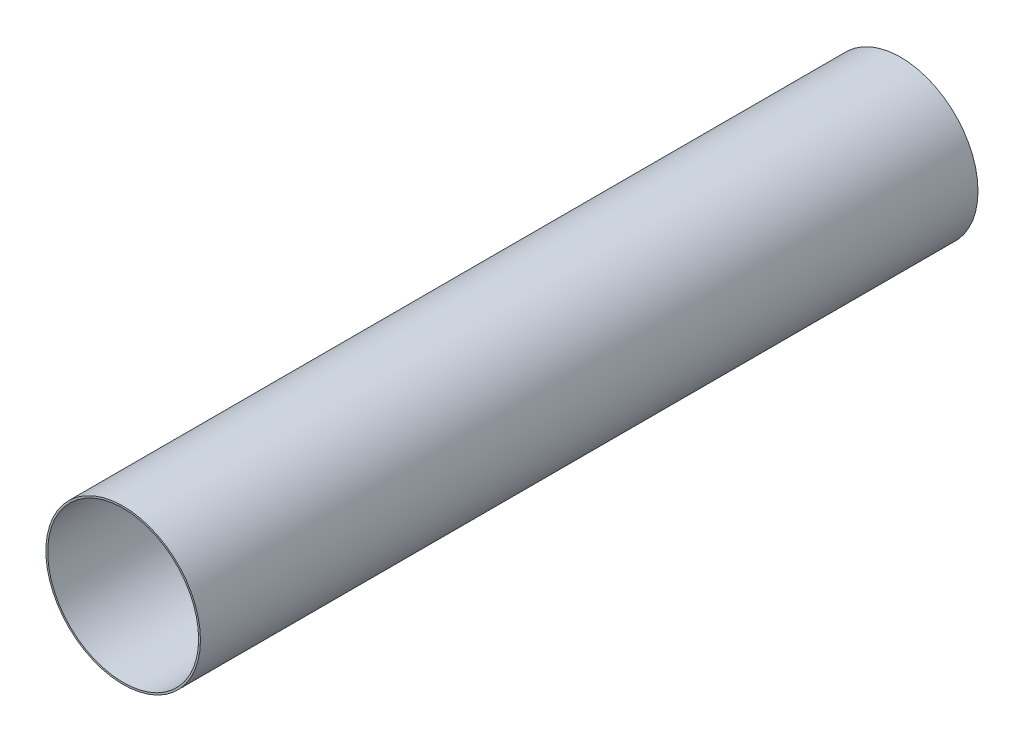
ISO-10303-21;
HEADER;
FILE_DESCRIPTION(('STEP AP214'),'2;1');
FILE_NAME('part.step','',(''),(''),'','','');
FILE_SCHEMA(('AUTOMOTIVE_DESIGN { 1 0 10303 214 1 1 1 1 }'));
ENDSEC;
DATA;
#1=APPLICATION_CONTEXT('core data for automotive mechanical design processes');
#2=APPLICATION_PROTOCOL_DEFINITION('international standard','automotive_design',2000,#1);
#3=PRODUCT_CONTEXT('',#1,'mechanical');
#4=PRODUCT('Part','Part','',(#3));
#5=PRODUCT_RELATED_PRODUCT_CATEGORY('part','',(#4));
#6=PRODUCT_DEFINITION_FORMATION('','',#4);
#7=PRODUCT_DEFINITION_CONTEXT('part definition',#1,'design');
#8=PRODUCT_DEFINITION('design','',#6,#7);
#9=PRODUCT_DEFINITION_SHAPE('','',#8);
#10=(LENGTH_UNIT() NAMED_UNIT(*) SI_UNIT(.MILLI.,.METRE.));
#11=(NAMED_UNIT(*) PLANE_ANGLE_UNIT() SI_UNIT($,.RADIAN.));
#12=(NAMED_UNIT(*) SI_UNIT($,.STERADIAN.) SOLID_ANGLE_UNIT());
#13=UNCERTAINTY_MEASURE_WITH_UNIT(LENGTH_MEASURE(1.E-05),#10,'distance_accuracy_value','');
#14=(GEOMETRIC_REPRESENTATION_CONTEXT(3) GLOBAL_UNCERTAINTY_ASSIGNED_CONTEXT((#13)) GLOBAL_UNIT_ASSIGNED_CONTEXT((#10,
#11,#12)) REPRESENTATION_CONTEXT('',''));
#15=CARTESIAN_POINT('',(0.,0.,0.));
#16=DIRECTION('',(0.,0.,1.));
#17=DIRECTION('',(1.,0.,0.));
#18=AXIS2_PLACEMENT_3D('',#15,#16,#17);
#19=CARTESIAN_POINT('',(0.,0.,850.));
#20=DIRECTION('',(0.,0.,1.));
#21=DIRECTION('',(1.,0.,0.));
#22=AXIS2_PLACEMENT_3D('',#19,#20,#21);
#23=CYLINDRICAL_SURFACE('',#22,82.5);
#24=CARTESIAN_POINT('',(0.,0.,0.));
#25=DIRECTION('',(0.,0.,1.));
#26=DIRECTION('',(1.,0.,0.));
#27=AXIS2_PLACEMENT_3D('',#24,#25,#26);
#28=CIRCLE('',#27,82.5);
#29=CARTESIAN_POINT('',(82.5,0.,0.));
#30=VERTEX_POINT('',#29);
#31=EDGE_CURVE('E27',#30,#30,#28,.F.);
#32=ORIENTED_EDGE('',*,*,#31,.T.);
#33=EDGE_LOOP('',(#32));
#34=FACE_BOUND('',#33,.T.);
#35=CARTESIAN_POINT('',(0.,0.,850.));
#36=DIRECTION('',(0.,0.,1.));
#37=DIRECTION('',(1.,0.,0.));
#38=AXIS2_PLACEMENT_3D('',#35,#36,#37);
#39=CIRCLE('',#38,82.5);
#40=CARTESIAN_POINT('',(82.5,0.,850.));
#41=VERTEX_POINT('',#40);
#42=EDGE_CURVE('E18',#41,#41,#39,.F.);
#43=ORIENTED_EDGE('',*,*,#42,.F.);
#44=EDGE_LOOP('',(#43));
#45=FACE_BOUND('',#44,.T.);
#46=ADVANCED_FACE('F15',(#34,#45),#23,.F.);
#47=CARTESIAN_POINT('',(0.,0.,850.));
#48=DIRECTION('',(0.,0.,1.));
#49=DIRECTION('',(1.,0.,0.));
#50=AXIS2_PLACEMENT_3D('',#47,#48,#49);
#51=PLANE('',#50);
#52=CARTESIAN_POINT('',(0.,0.,850.));
#53=DIRECTION('',(0.,0.,1.));
#54=DIRECTION('',(1.,0.,0.));
#55=AXIS2_PLACEMENT_3D('',#52,#53,#54);
#56=CIRCLE('',#55,84.5);
#57=CARTESIAN_POINT('',(84.5,0.,850.));
#58=VERTEX_POINT('',#57);
#59=EDGE_CURVE('E22',#58,#58,#56,.F.);
#60=ORIENTED_EDGE('',*,*,#59,.F.);
#61=EDGE_LOOP('',(#60));
#62=FACE_BOUND('',#61,.T.);
#63=ORIENTED_EDGE('',*,*,#42,.T.);
#64=EDGE_LOOP('',(#63));
#65=FACE_BOUND('',#64,.T.);
#66=ADVANCED_FACE('F35',(#62,#65),#51,.T.);
#67=CARTESIAN_POINT('',(0.,0.,0.));
#68=DIRECTION('',(0.,0.,1.));
#69=DIRECTION('',(1.,0.,0.));
#70=AXIS2_PLACEMENT_3D('',#67,#68,#69);
#71=PLANE('',#70);
#72=CARTESIAN_POINT('',(0.,0.,0.));
#73=DIRECTION('',(0.,0.,1.));
#74=DIRECTION('',(1.,0.,0.));
#75=AXIS2_PLACEMENT_3D('',#72,#73,#74);
#76=CIRCLE('',#75,84.5);
#77=CARTESIAN_POINT('',(84.5,0.,0.));
#78=VERTEX_POINT('',#77);
#79=EDGE_CURVE('E10',#78,#78,#76,.T.);
#80=ORIENTED_EDGE('',*,*,#79,.F.);
#81=EDGE_LOOP('',(#80));
#82=FACE_BOUND('',#81,.T.);
#83=ORIENTED_EDGE('',*,*,#31,.F.);
#84=EDGE_LOOP('',(#83));
#85=FACE_BOUND('',#84,.T.);
#86=ADVANCED_FACE('F42',(#82,#85),#71,.F.);
#87=CARTESIAN_POINT('',(0.,0.,850.));
#88=DIRECTION('',(0.,0.,1.));
#89=DIRECTION('',(1.,0.,0.));
#90=AXIS2_PLACEMENT_3D('',#87,#88,#89);
#91=CYLINDRICAL_SURFACE('',#90,84.5);
#92=ORIENTED_EDGE('',*,*,#79,.T.);
#93=EDGE_LOOP('',(#92));
#94=FACE_BOUND('',#93,.T.);
#95=ORIENTED_EDGE('',*,*,#59,.T.);
#96=EDGE_LOOP('',(#95));
#97=FACE_BOUND('',#96,.T.);
#98=ADVANCED_FACE('F44',(#94,#97),#91,.T.);
#99=CLOSED_SHELL('',(#46,#66,#86,#98));
#100=MANIFOLD_SOLID_BREP('B1',#99);
#101=ADVANCED_BREP_SHAPE_REPRESENTATION('',(#18,#100),#14);
#102=SHAPE_DEFINITION_REPRESENTATION(#9,#101);
ENDSEC;
END-ISO-10303-21;
